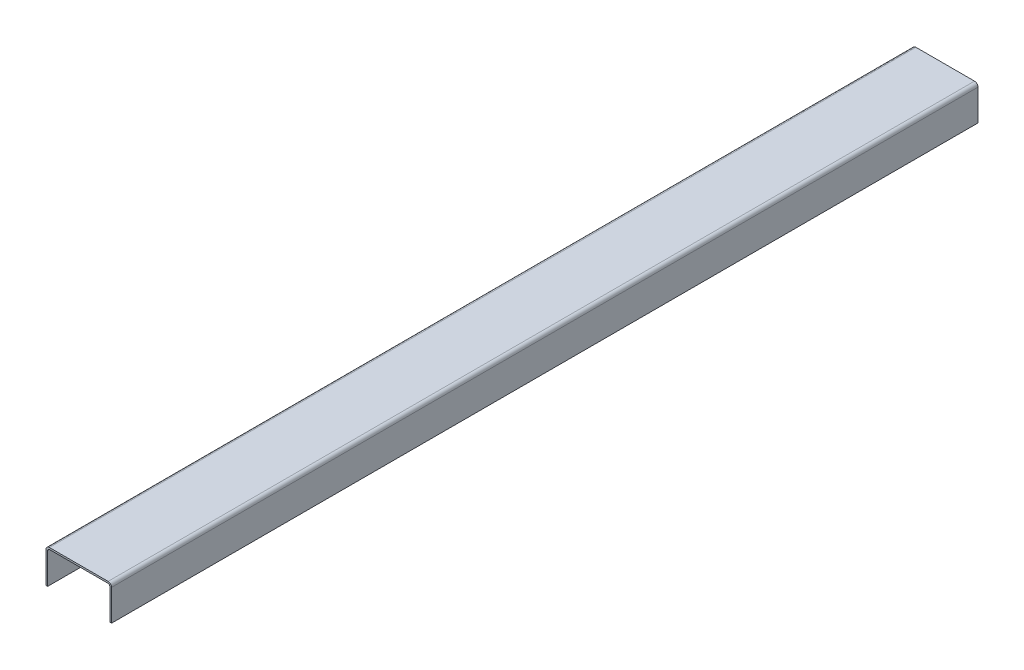
ISO-10303-21;
HEADER;
FILE_DESCRIPTION(('STEP AP214'),'2;1');
FILE_NAME('part.step','',(''),(''),'','','');
FILE_SCHEMA(('AUTOMOTIVE_DESIGN { 1 0 10303 214 1 1 1 1 }'));
ENDSEC;
DATA;
#1=APPLICATION_CONTEXT('core data for automotive mechanical design processes');
#2=APPLICATION_PROTOCOL_DEFINITION('international standard','automotive_design',2000,#1);
#3=PRODUCT_CONTEXT('',#1,'mechanical');
#4=PRODUCT('Part','Part','',(#3));
#5=PRODUCT_RELATED_PRODUCT_CATEGORY('part','',(#4));
#6=PRODUCT_DEFINITION_FORMATION('','',#4);
#7=PRODUCT_DEFINITION_CONTEXT('part definition',#1,'design');
#8=PRODUCT_DEFINITION('design','',#6,#7);
#9=PRODUCT_DEFINITION_SHAPE('','',#8);
#10=(LENGTH_UNIT() NAMED_UNIT(*) SI_UNIT(.MILLI.,.METRE.));
#11=(NAMED_UNIT(*) PLANE_ANGLE_UNIT() SI_UNIT($,.RADIAN.));
#12=(NAMED_UNIT(*) SI_UNIT($,.STERADIAN.) SOLID_ANGLE_UNIT());
#13=UNCERTAINTY_MEASURE_WITH_UNIT(LENGTH_MEASURE(1.E-05),#10,'distance_accuracy_value','');
#14=(GEOMETRIC_REPRESENTATION_CONTEXT(3) GLOBAL_UNCERTAINTY_ASSIGNED_CONTEXT((#13)) GLOBAL_UNIT_ASSIGNED_CONTEXT((#10,
#11,#12)) REPRESENTATION_CONTEXT('',''));
#15=CARTESIAN_POINT('',(0.,0.,0.));
#16=DIRECTION('',(0.,0.,1.));
#17=DIRECTION('',(1.,0.,0.));
#18=AXIS2_PLACEMENT_3D('',#15,#16,#17);
#19=CARTESIAN_POINT('',(0.,0.,502.33));
#20=DIRECTION('',(0.,1.,0.));
#21=DIRECTION('',(0.,0.,1.));
#22=AXIS2_PLACEMENT_3D('',#19,#20,#21);
#23=PLANE('',#22);
#24=DIRECTION('',(1.,0.,0.));
#25=VECTOR('',#24,1.);
#26=CARTESIAN_POINT('',(0.,0.,0.));
#27=LINE('',#26,#25);
#28=CARTESIAN_POINT('',(0.,0.,0.));
#29=VERTEX_POINT('',#28);
#30=CARTESIAN_POINT('',(1.,0.,0.));
#31=VERTEX_POINT('',#30);
#32=EDGE_CURVE('E164',#29,#31,#27,.T.);
#33=ORIENTED_EDGE('',*,*,#32,.T.);
#34=DIRECTION('',(0.,0.,-1.));
#35=VECTOR('',#34,1.);
#36=CARTESIAN_POINT('',(1.,0.,502.33));
#37=LINE('',#36,#35);
#38=CARTESIAN_POINT('',(1.,0.,502.33));
#39=VERTEX_POINT('',#38);
#40=EDGE_CURVE('E11',#39,#31,#37,.T.);
#41=ORIENTED_EDGE('',*,*,#40,.F.);
#42=DIRECTION('',(1.,0.,0.));
#43=VECTOR('',#42,1.);
#44=CARTESIAN_POINT('',(0.,0.,502.33));
#45=LINE('',#44,#43);
#46=CARTESIAN_POINT('',(0.,0.,502.33));
#47=VERTEX_POINT('',#46);
#48=EDGE_CURVE('E198',#47,#39,#45,.T.);
#49=ORIENTED_EDGE('',*,*,#48,.F.);
#50=DIRECTION('',(0.,0.,-1.));
#51=VECTOR('',#50,1.);
#52=CARTESIAN_POINT('',(0.,0.,502.33));
#53=LINE('',#52,#51);
#54=EDGE_CURVE('E160',#47,#29,#53,.T.);
#55=ORIENTED_EDGE('',*,*,#54,.T.);
#56=EDGE_LOOP('',(#33,#41,#49,#55));
#57=FACE_BOUND('',#56,.T.);
#58=ADVANCED_FACE('F39',(#57),#23,.F.);
#59=CARTESIAN_POINT('',(1.,0.,502.33));
#60=DIRECTION('',(-1.,0.,0.));
#61=DIRECTION('',(0.,0.,1.));
#62=AXIS2_PLACEMENT_3D('',#59,#60,#61);
#63=PLANE('',#62);
#64=DIRECTION('',(0.,1.,0.));
#65=VECTOR('',#64,1.);
#66=CARTESIAN_POINT('',(1.,0.,0.));
#67=LINE('',#66,#65);
#68=CARTESIAN_POINT('',(1.,18.,0.));
#69=VERTEX_POINT('',#68);
#70=EDGE_CURVE('E168',#31,#69,#67,.T.);
#71=ORIENTED_EDGE('',*,*,#70,.T.);
#72=DIRECTION('',(0.,0.,-1.));
#73=VECTOR('',#72,1.);
#74=CARTESIAN_POINT('',(1.,18.,502.33));
#75=LINE('',#74,#73);
#76=CARTESIAN_POINT('',(1.,18.,502.33));
#77=VERTEX_POINT('',#76);
#78=EDGE_CURVE('E48',#77,#69,#75,.T.);
#79=ORIENTED_EDGE('',*,*,#78,.F.);
#80=DIRECTION('',(0.,1.,0.));
#81=VECTOR('',#80,1.);
#82=CARTESIAN_POINT('',(1.,0.,502.33));
#83=LINE('',#82,#81);
#84=EDGE_CURVE('E111',#39,#77,#83,.T.);
#85=ORIENTED_EDGE('',*,*,#84,.F.);
#86=ORIENTED_EDGE('',*,*,#40,.T.);
#87=EDGE_LOOP('',(#71,#79,#85,#86));
#88=FACE_BOUND('',#87,.T.);
#89=ADVANCED_FACE('F292',(#88),#63,.F.);
#90=CARTESIAN_POINT('',(2.,18.,502.33));
#91=DIRECTION('',(0.,0.,-1.));
#92=DIRECTION('',(-1.,0.,0.));
#93=AXIS2_PLACEMENT_3D('',#90,#91,#92);
#94=CYLINDRICAL_SURFACE('',#93,1.);
#95=CARTESIAN_POINT('',(2.,18.,0.));
#96=DIRECTION('',(0.,0.,-1.));
#97=DIRECTION('',(-1.,0.,0.));
#98=AXIS2_PLACEMENT_3D('',#95,#96,#97);
#99=CIRCLE('',#98,1.);
#100=CARTESIAN_POINT('',(2.,19.,0.));
#101=VERTEX_POINT('',#100);
#102=EDGE_CURVE('E171',#69,#101,#99,.T.);
#103=ORIENTED_EDGE('',*,*,#102,.T.);
#104=DIRECTION('',(0.,0.,-1.));
#105=VECTOR('',#104,1.);
#106=CARTESIAN_POINT('',(2.,19.,502.33));
#107=LINE('',#106,#105);
#108=CARTESIAN_POINT('',(2.,19.,502.33));
#109=VERTEX_POINT('',#108);
#110=EDGE_CURVE('E225',#109,#101,#107,.T.);
#111=ORIENTED_EDGE('',*,*,#110,.F.);
#112=CARTESIAN_POINT('',(2.,18.,502.33));
#113=DIRECTION('',(0.,0.,-1.));
#114=DIRECTION('',(-1.,0.,0.));
#115=AXIS2_PLACEMENT_3D('',#112,#113,#114);
#116=CIRCLE('',#115,1.);
#117=EDGE_CURVE('E235',#77,#109,#116,.T.);
#118=ORIENTED_EDGE('',*,*,#117,.F.);
#119=ORIENTED_EDGE('',*,*,#78,.T.);
#120=EDGE_LOOP('',(#103,#111,#118,#119));
#121=FACE_BOUND('',#120,.T.);
#122=ADVANCED_FACE('F233',(#121),#94,.F.);
#123=CARTESIAN_POINT('',(2.,19.,502.33));
#124=DIRECTION('',(0.,1.,0.));
#125=DIRECTION('',(-1.,0.,0.));
#126=AXIS2_PLACEMENT_3D('',#123,#124,#125);
#127=PLANE('',#126);
#128=DIRECTION('',(1.,0.,0.));
#129=VECTOR('',#128,1.);
#130=CARTESIAN_POINT('',(2.,19.,0.));
#131=LINE('',#130,#129);
#132=CARTESIAN_POINT('',(36.,19.,0.));
#133=VERTEX_POINT('',#132);
#134=EDGE_CURVE('E174',#101,#133,#131,.T.);
#135=ORIENTED_EDGE('',*,*,#134,.T.);
#136=DIRECTION('',(0.,0.,-1.));
#137=VECTOR('',#136,1.);
#138=CARTESIAN_POINT('',(36.,19.,502.33));
#139=LINE('',#138,#137);
#140=CARTESIAN_POINT('',(36.,19.,502.33));
#141=VERTEX_POINT('',#140);
#142=EDGE_CURVE('E221',#141,#133,#139,.T.);
#143=ORIENTED_EDGE('',*,*,#142,.F.);
#144=DIRECTION('',(1.,0.,0.));
#145=VECTOR('',#144,1.);
#146=CARTESIAN_POINT('',(2.,19.,502.33));
#147=LINE('',#146,#145);
#148=EDGE_CURVE('E254',#109,#141,#147,.T.);
#149=ORIENTED_EDGE('',*,*,#148,.F.);
#150=ORIENTED_EDGE('',*,*,#110,.T.);
#151=EDGE_LOOP('',(#135,#143,#149,#150));
#152=FACE_BOUND('',#151,.T.);
#153=ADVANCED_FACE('F244',(#152),#127,.F.);
#154=CARTESIAN_POINT('',(36.,18.,502.33));
#155=DIRECTION('',(0.,0.,-1.));
#156=DIRECTION('',(-1.,0.,0.));
#157=AXIS2_PLACEMENT_3D('',#154,#155,#156);
#158=CYLINDRICAL_SURFACE('',#157,0.999999999999999);
#159=CARTESIAN_POINT('',(36.,18.,0.));
#160=DIRECTION('',(0.,0.,-1.));
#161=DIRECTION('',(-1.,0.,0.));
#162=AXIS2_PLACEMENT_3D('',#159,#160,#161);
#163=CIRCLE('',#162,0.999999999999999);
#164=CARTESIAN_POINT('',(37.,18.,0.));
#165=VERTEX_POINT('',#164);
#166=EDGE_CURVE('E177',#133,#165,#163,.T.);
#167=ORIENTED_EDGE('',*,*,#166,.T.);
#168=DIRECTION('',(0.,0.,-1.));
#169=VECTOR('',#168,1.);
#170=CARTESIAN_POINT('',(37.,18.,502.33));
#171=LINE('',#170,#169);
#172=CARTESIAN_POINT('',(37.,18.,502.33));
#173=VERTEX_POINT('',#172);
#174=EDGE_CURVE('E217',#173,#165,#171,.T.);
#175=ORIENTED_EDGE('',*,*,#174,.F.);
#176=CARTESIAN_POINT('',(36.,18.,502.33));
#177=DIRECTION('',(0.,0.,-1.));
#178=DIRECTION('',(-1.,0.,0.));
#179=AXIS2_PLACEMENT_3D('',#176,#177,#178);
#180=CIRCLE('',#179,0.999999999999999);
#181=EDGE_CURVE('E250',#141,#173,#180,.T.);
#182=ORIENTED_EDGE('',*,*,#181,.F.);
#183=ORIENTED_EDGE('',*,*,#142,.T.);
#184=EDGE_LOOP('',(#167,#175,#182,#183));
#185=FACE_BOUND('',#184,.T.);
#186=ADVANCED_FACE('F248',(#185),#158,.F.);
#187=CARTESIAN_POINT('',(37.,18.,502.33));
#188=DIRECTION('',(1.,0.,0.));
#189=DIRECTION('',(0.,0.,-1.));
#190=AXIS2_PLACEMENT_3D('',#187,#188,#189);
#191=PLANE('',#190);
#192=DIRECTION('',(0.,-1.,0.));
#193=VECTOR('',#192,1.);
#194=CARTESIAN_POINT('',(37.,18.,0.));
#195=LINE('',#194,#193);
#196=CARTESIAN_POINT('',(37.,0.,0.));
#197=VERTEX_POINT('',#196);
#198=EDGE_CURVE('E180',#165,#197,#195,.T.);
#199=ORIENTED_EDGE('',*,*,#198,.T.);
#200=DIRECTION('',(0.,0.,-1.));
#201=VECTOR('',#200,1.);
#202=CARTESIAN_POINT('',(37.,0.,502.33));
#203=LINE('',#202,#201);
#204=CARTESIAN_POINT('',(37.,0.,502.33));
#205=VERTEX_POINT('',#204);
#206=EDGE_CURVE('E213',#205,#197,#203,.T.);
#207=ORIENTED_EDGE('',*,*,#206,.F.);
#208=DIRECTION('',(0.,-1.,0.));
#209=VECTOR('',#208,1.);
#210=CARTESIAN_POINT('',(37.,18.,502.33));
#211=LINE('',#210,#209);
#212=EDGE_CURVE('E253',#173,#205,#211,.T.);
#213=ORIENTED_EDGE('',*,*,#212,.F.);
#214=ORIENTED_EDGE('',*,*,#174,.T.);
#215=EDGE_LOOP('',(#199,#207,#213,#214));
#216=FACE_BOUND('',#215,.T.);
#217=ADVANCED_FACE('F305',(#216),#191,.F.);
#218=CARTESIAN_POINT('',(37.,0.,502.33));
#219=DIRECTION('',(0.,1.,0.));
#220=DIRECTION('',(0.,0.,1.));
#221=AXIS2_PLACEMENT_3D('',#218,#219,#220);
#222=PLANE('',#221);
#223=DIRECTION('',(1.,0.,0.));
#224=VECTOR('',#223,1.);
#225=CARTESIAN_POINT('',(37.,0.,0.));
#226=LINE('',#225,#224);
#227=CARTESIAN_POINT('',(38.,0.,0.));
#228=VERTEX_POINT('',#227);
#229=EDGE_CURVE('E183',#197,#228,#226,.T.);
#230=ORIENTED_EDGE('',*,*,#229,.T.);
#231=DIRECTION('',(0.,0.,-1.));
#232=VECTOR('',#231,1.);
#233=CARTESIAN_POINT('',(38.,0.,502.33));
#234=LINE('',#233,#232);
#235=CARTESIAN_POINT('',(38.,0.,502.33));
#236=VERTEX_POINT('',#235);
#237=EDGE_CURVE('E209',#236,#228,#234,.T.);
#238=ORIENTED_EDGE('',*,*,#237,.F.);
#239=DIRECTION('',(1.,0.,0.));
#240=VECTOR('',#239,1.);
#241=CARTESIAN_POINT('',(37.,0.,502.33));
#242=LINE('',#241,#240);
#243=EDGE_CURVE('E258',#205,#236,#242,.T.);
#244=ORIENTED_EDGE('',*,*,#243,.F.);
#245=ORIENTED_EDGE('',*,*,#206,.T.);
#246=EDGE_LOOP('',(#230,#238,#244,#245));
#247=FACE_BOUND('',#246,.T.);
#248=ADVANCED_FACE('F308',(#247),#222,.F.);
#249=CARTESIAN_POINT('',(38.,18.,502.33));
#250=DIRECTION('',(-1.,0.,0.));
#251=DIRECTION('',(0.,-1.,0.));
#252=AXIS2_PLACEMENT_3D('',#249,#250,#251);
#253=PLANE('',#252);
#254=DIRECTION('',(0.,1.,0.));
#255=VECTOR('',#254,1.);
#256=CARTESIAN_POINT('',(38.,18.,0.));
#257=LINE('',#256,#255);
#258=CARTESIAN_POINT('',(38.,18.,0.));
#259=VERTEX_POINT('',#258);
#260=EDGE_CURVE('E186',#228,#259,#257,.T.);
#261=ORIENTED_EDGE('',*,*,#260,.T.);
#262=DIRECTION('',(0.,0.,-1.));
#263=VECTOR('',#262,1.);
#264=CARTESIAN_POINT('',(38.,18.,502.33));
#265=LINE('',#264,#263);
#266=CARTESIAN_POINT('',(38.,18.,502.33));
#267=VERTEX_POINT('',#266);
#268=EDGE_CURVE('E205',#267,#259,#265,.T.);
#269=ORIENTED_EDGE('',*,*,#268,.F.);
#270=DIRECTION('',(0.,1.,0.));
#271=VECTOR('',#270,1.);
#272=CARTESIAN_POINT('',(38.,18.,502.33));
#273=LINE('',#272,#271);
#274=EDGE_CURVE('E265',#236,#267,#273,.T.);
#275=ORIENTED_EDGE('',*,*,#274,.F.);
#276=ORIENTED_EDGE('',*,*,#237,.T.);
#277=EDGE_LOOP('',(#261,#269,#275,#276));
#278=FACE_BOUND('',#277,.T.);
#279=ADVANCED_FACE('F273',(#278),#253,.F.);
#280=CARTESIAN_POINT('',(36.,18.,502.33));
#281=DIRECTION('',(0.,0.,-1.));
#282=DIRECTION('',(-1.,0.,0.));
#283=AXIS2_PLACEMENT_3D('',#280,#281,#282);
#284=CYLINDRICAL_SURFACE('',#283,2.);
#285=CARTESIAN_POINT('',(36.,18.,0.));
#286=DIRECTION('',(0.,0.,1.));
#287=DIRECTION('',(-1.,0.,0.));
#288=AXIS2_PLACEMENT_3D('',#285,#286,#287);
#289=CIRCLE('',#288,2.);
#290=CARTESIAN_POINT('',(36.,20.,0.));
#291=VERTEX_POINT('',#290);
#292=EDGE_CURVE('E189',#259,#291,#289,.T.);
#293=ORIENTED_EDGE('',*,*,#292,.T.);
#294=DIRECTION('',(0.,0.,-1.));
#295=VECTOR('',#294,1.);
#296=CARTESIAN_POINT('',(36.,20.,502.33));
#297=LINE('',#296,#295);
#298=CARTESIAN_POINT('',(36.,20.,502.33));
#299=VERTEX_POINT('',#298);
#300=EDGE_CURVE('E153',#299,#291,#297,.T.);
#301=ORIENTED_EDGE('',*,*,#300,.F.);
#302=CARTESIAN_POINT('',(36.,18.,502.33));
#303=DIRECTION('',(0.,0.,1.));
#304=DIRECTION('',(-1.,0.,0.));
#305=AXIS2_PLACEMENT_3D('',#302,#303,#304);
#306=CIRCLE('',#305,2.);
#307=EDGE_CURVE('E142',#267,#299,#306,.T.);
#308=ORIENTED_EDGE('',*,*,#307,.F.);
#309=ORIENTED_EDGE('',*,*,#268,.T.);
#310=EDGE_LOOP('',(#293,#301,#308,#309));
#311=FACE_BOUND('',#310,.T.);
#312=ADVANCED_FACE('F277',(#311),#284,.T.);
#313=CARTESIAN_POINT('',(2.,20.,502.33));
#314=DIRECTION('',(0.,-1.,0.));
#315=DIRECTION('',(0.,0.,-1.));
#316=AXIS2_PLACEMENT_3D('',#313,#314,#315);
#317=PLANE('',#316);
#318=DIRECTION('',(-1.,0.,0.));
#319=VECTOR('',#318,1.);
#320=CARTESIAN_POINT('',(2.,20.,0.));
#321=LINE('',#320,#319);
#322=CARTESIAN_POINT('',(2.,20.,0.));
#323=VERTEX_POINT('',#322);
#324=EDGE_CURVE('E151',#291,#323,#321,.T.);
#325=ORIENTED_EDGE('',*,*,#324,.T.);
#326=DIRECTION('',(0.,0.,-1.));
#327=VECTOR('',#326,1.);
#328=CARTESIAN_POINT('',(2.,20.,502.33));
#329=LINE('',#328,#327);
#330=CARTESIAN_POINT('',(2.,20.,502.33));
#331=VERTEX_POINT('',#330);
#332=EDGE_CURVE('E148',#331,#323,#329,.T.);
#333=ORIENTED_EDGE('',*,*,#332,.F.);
#334=DIRECTION('',(-1.,0.,0.));
#335=VECTOR('',#334,1.);
#336=CARTESIAN_POINT('',(2.,20.,502.33));
#337=LINE('',#336,#335);
#338=EDGE_CURVE('E136',#299,#331,#337,.T.);
#339=ORIENTED_EDGE('',*,*,#338,.F.);
#340=ORIENTED_EDGE('',*,*,#300,.T.);
#341=EDGE_LOOP('',(#325,#333,#339,#340));
#342=FACE_BOUND('',#341,.T.);
#343=ADVANCED_FACE('F149',(#342),#317,.F.);
#344=CARTESIAN_POINT('',(2.,18.,502.33));
#345=DIRECTION('',(0.,0.,-1.));
#346=DIRECTION('',(-1.,0.,0.));
#347=AXIS2_PLACEMENT_3D('',#344,#345,#346);
#348=CYLINDRICAL_SURFACE('',#347,2.);
#349=CARTESIAN_POINT('',(2.,18.,0.));
#350=DIRECTION('',(0.,0.,1.));
#351=DIRECTION('',(-1.,0.,0.));
#352=AXIS2_PLACEMENT_3D('',#349,#350,#351);
#353=CIRCLE('',#352,2.);
#354=CARTESIAN_POINT('',(0.,18.,0.));
#355=VERTEX_POINT('',#354);
#356=EDGE_CURVE('E97',#323,#355,#353,.T.);
#357=ORIENTED_EDGE('',*,*,#356,.T.);
#358=DIRECTION('',(0.,0.,-1.));
#359=VECTOR('',#358,1.);
#360=CARTESIAN_POINT('',(0.,18.,502.33));
#361=LINE('',#360,#359);
#362=CARTESIAN_POINT('',(0.,18.,502.33));
#363=VERTEX_POINT('',#362);
#364=EDGE_CURVE('E154',#363,#355,#361,.T.);
#365=ORIENTED_EDGE('',*,*,#364,.F.);
#366=CARTESIAN_POINT('',(2.,18.,502.33));
#367=DIRECTION('',(0.,0.,1.));
#368=DIRECTION('',(-1.,0.,0.));
#369=AXIS2_PLACEMENT_3D('',#366,#367,#368);
#370=CIRCLE('',#369,2.);
#371=EDGE_CURVE('E140',#331,#363,#370,.T.);
#372=ORIENTED_EDGE('',*,*,#371,.F.);
#373=ORIENTED_EDGE('',*,*,#332,.T.);
#374=EDGE_LOOP('',(#357,#365,#372,#373));
#375=FACE_BOUND('',#374,.T.);
#376=ADVANCED_FACE('F156',(#375),#348,.T.);
#377=CARTESIAN_POINT('',(0.,0.,502.33));
#378=DIRECTION('',(1.,0.,0.));
#379=DIRECTION('',(0.,1.,0.));
#380=AXIS2_PLACEMENT_3D('',#377,#378,#379);
#381=PLANE('',#380);
#382=DIRECTION('',(0.,-1.,0.));
#383=VECTOR('',#382,1.);
#384=CARTESIAN_POINT('',(0.,0.,0.));
#385=LINE('',#384,#383);
#386=EDGE_CURVE('E103',#355,#29,#385,.T.);
#387=ORIENTED_EDGE('',*,*,#386,.T.);
#388=ORIENTED_EDGE('',*,*,#54,.F.);
#389=DIRECTION('',(0.,-1.,0.));
#390=VECTOR('',#389,1.);
#391=CARTESIAN_POINT('',(0.,0.,502.33));
#392=LINE('',#391,#390);
#393=EDGE_CURVE('E56',#363,#47,#392,.T.);
#394=ORIENTED_EDGE('',*,*,#393,.F.);
#395=ORIENTED_EDGE('',*,*,#364,.T.);
#396=EDGE_LOOP('',(#387,#388,#394,#395));
#397=FACE_BOUND('',#396,.T.);
#398=ADVANCED_FACE('F281',(#397),#381,.F.);
#399=CARTESIAN_POINT('',(2.,18.,502.33));
#400=DIRECTION('',(0.,0.,-1.));
#401=DIRECTION('',(-1.,0.,0.));
#402=AXIS2_PLACEMENT_3D('',#399,#400,#401);
#403=PLANE('',#402);
#404=ORIENTED_EDGE('',*,*,#48,.T.);
#405=ORIENTED_EDGE('',*,*,#84,.T.);
#406=ORIENTED_EDGE('',*,*,#117,.T.);
#407=ORIENTED_EDGE('',*,*,#148,.T.);
#408=ORIENTED_EDGE('',*,*,#181,.T.);
#409=ORIENTED_EDGE('',*,*,#212,.T.);
#410=ORIENTED_EDGE('',*,*,#243,.T.);
#411=ORIENTED_EDGE('',*,*,#274,.T.);
#412=ORIENTED_EDGE('',*,*,#307,.T.);
#413=ORIENTED_EDGE('',*,*,#338,.T.);
#414=ORIENTED_EDGE('',*,*,#371,.T.);
#415=ORIENTED_EDGE('',*,*,#393,.T.);
#416=EDGE_LOOP('',(#404,#405,#406,#407,#408,#409,#410,#411,#412,#413,#414,#415));
#417=FACE_BOUND('',#416,.T.);
#418=ADVANCED_FACE('F138',(#417),#403,.F.);
#419=CARTESIAN_POINT('',(2.,18.,0.));
#420=DIRECTION('',(0.,0.,-1.));
#421=DIRECTION('',(-1.,0.,0.));
#422=AXIS2_PLACEMENT_3D('',#419,#420,#421);
#423=PLANE('',#422);
#424=ORIENTED_EDGE('',*,*,#32,.F.);
#425=ORIENTED_EDGE('',*,*,#386,.F.);
#426=ORIENTED_EDGE('',*,*,#356,.F.);
#427=ORIENTED_EDGE('',*,*,#324,.F.);
#428=ORIENTED_EDGE('',*,*,#292,.F.);
#429=ORIENTED_EDGE('',*,*,#260,.F.);
#430=ORIENTED_EDGE('',*,*,#229,.F.);
#431=ORIENTED_EDGE('',*,*,#198,.F.);
#432=ORIENTED_EDGE('',*,*,#166,.F.);
#433=ORIENTED_EDGE('',*,*,#134,.F.);
#434=ORIENTED_EDGE('',*,*,#102,.F.);
#435=ORIENTED_EDGE('',*,*,#70,.F.);
#436=EDGE_LOOP('',(#424,#425,#426,#427,#428,#429,#430,#431,#432,#433,#434,#435));
#437=FACE_BOUND('',#436,.T.);
#438=ADVANCED_FACE('F239',(#437),#423,.T.);
#439=CLOSED_SHELL('',(#58,#89,#122,#153,#186,#217,#248,#279,#312,#343,#376,#398,#418,#438));
#440=MANIFOLD_SOLID_BREP('B2',#439);
#441=ADVANCED_BREP_SHAPE_REPRESENTATION('',(#18,#440),#14);
#442=SHAPE_DEFINITION_REPRESENTATION(#9,#441);
ENDSEC;
END-ISO-10303-21;
